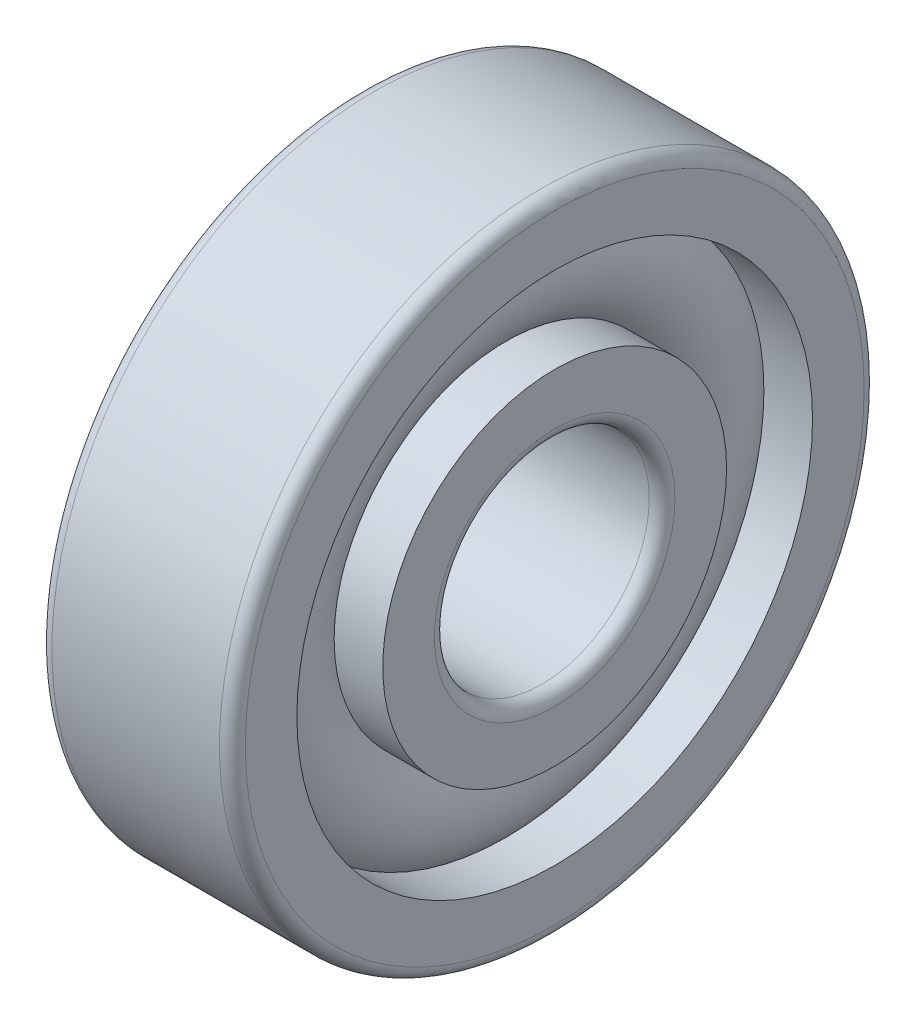
ISO-10303-21;
HEADER;
FILE_DESCRIPTION(('STEP AP214'),'2;1');
FILE_NAME('part.step','',(''),(''),'','','');
FILE_SCHEMA(('AUTOMOTIVE_DESIGN { 1 0 10303 214 1 1 1 1 }'));
ENDSEC;
DATA;
#1=APPLICATION_CONTEXT('core data for automotive mechanical design processes');
#2=APPLICATION_PROTOCOL_DEFINITION('international standard','automotive_design',2000,#1);
#3=PRODUCT_CONTEXT('',#1,'mechanical');
#4=PRODUCT('Part','Part','',(#3));
#5=PRODUCT_RELATED_PRODUCT_CATEGORY('part','',(#4));
#6=PRODUCT_DEFINITION_FORMATION('','',#4);
#7=PRODUCT_DEFINITION_CONTEXT('part definition',#1,'design');
#8=PRODUCT_DEFINITION('design','',#6,#7);
#9=PRODUCT_DEFINITION_SHAPE('','',#8);
#10=(LENGTH_UNIT() NAMED_UNIT(*) SI_UNIT(.MILLI.,.METRE.));
#11=(NAMED_UNIT(*) PLANE_ANGLE_UNIT() SI_UNIT($,.RADIAN.));
#12=(NAMED_UNIT(*) SI_UNIT($,.STERADIAN.) SOLID_ANGLE_UNIT());
#13=UNCERTAINTY_MEASURE_WITH_UNIT(LENGTH_MEASURE(1.E-05),#10,'distance_accuracy_value','');
#14=(GEOMETRIC_REPRESENTATION_CONTEXT(3) GLOBAL_UNCERTAINTY_ASSIGNED_CONTEXT((#13)) GLOBAL_UNIT_ASSIGNED_CONTEXT((#10,
#11,#12)) REPRESENTATION_CONTEXT('',''));
#15=CARTESIAN_POINT('',(0.,0.,0.));
#16=DIRECTION('',(0.,0.,1.));
#17=DIRECTION('',(1.,0.,0.));
#18=AXIS2_PLACEMENT_3D('',#15,#16,#17);
#19=CARTESIAN_POINT('',(0.,0.,0.));
#20=DIRECTION('',(-1.,0.,0.));
#21=DIRECTION('',(0.,0.,1.));
#22=AXIS2_PLACEMENT_3D('',#19,#20,#21);
#23=TOROIDAL_SURFACE('',#22,10.,3.);
#24=CARTESIAN_POINT('',(2.23606797749979,0.,0.));
#25=DIRECTION('',(-1.,0.,0.));
#26=DIRECTION('',(0.,0.,1.));
#27=AXIS2_PLACEMENT_3D('',#24,#25,#26);
#28=CIRCLE('',#27,12.);
#29=CARTESIAN_POINT('',(2.23606797749979,0.,12.));
#30=VERTEX_POINT('',#29);
#31=EDGE_CURVE('E35',#30,#30,#28,.F.);
#32=ORIENTED_EDGE('',*,*,#31,.T.);
#33=EDGE_LOOP('',(#32));
#34=FACE_BOUND('',#33,.T.);
#35=CARTESIAN_POINT('',(2.23606797749979,0.,0.));
#36=DIRECTION('',(-1.,0.,0.));
#37=DIRECTION('',(0.,0.,1.));
#38=AXIS2_PLACEMENT_3D('',#35,#36,#37);
#39=CIRCLE('',#38,8.);
#40=CARTESIAN_POINT('',(2.23606797749979,0.,8.));
#41=VERTEX_POINT('',#40);
#42=EDGE_CURVE('E10',#41,#41,#39,.T.);
#43=ORIENTED_EDGE('',*,*,#42,.T.);
#44=EDGE_LOOP('',(#43));
#45=FACE_BOUND('',#44,.T.);
#46=ADVANCED_FACE('F31',(#34,#45),#23,.T.);
#47=CARTESIAN_POINT('',(-20.6375,0.,0.));
#48=DIRECTION('',(1.,0.,0.));
#49=DIRECTION('',(0.,0.,-1.));
#50=AXIS2_PLACEMENT_3D('',#47,#48,#49);
#51=CYLINDRICAL_SURFACE('',#50,8.);
#52=CARTESIAN_POINT('',(4.5,0.,0.));
#53=DIRECTION('',(1.,0.,0.));
#54=DIRECTION('',(0.,0.,-1.));
#55=AXIS2_PLACEMENT_3D('',#52,#53,#54);
#56=CIRCLE('',#55,8.);
#57=CARTESIAN_POINT('',(4.5,0.,-8.));
#58=VERTEX_POINT('',#57);
#59=EDGE_CURVE('E44',#58,#58,#56,.T.);
#60=ORIENTED_EDGE('',*,*,#59,.F.);
#61=EDGE_LOOP('',(#60));
#62=FACE_BOUND('',#61,.T.);
#63=ORIENTED_EDGE('',*,*,#42,.F.);
#64=EDGE_LOOP('',(#63));
#65=FACE_BOUND('',#64,.T.);
#66=ADVANCED_FACE('F83',(#62,#65),#51,.T.);
#67=CARTESIAN_POINT('',(-20.6375,0.,0.));
#68=DIRECTION('',(1.,0.,0.));
#69=DIRECTION('',(0.,0.,-1.));
#70=AXIS2_PLACEMENT_3D('',#67,#68,#69);
#71=CYLINDRICAL_SURFACE('',#70,8.);
#72=CARTESIAN_POINT('',(-4.5,0.,0.));
#73=DIRECTION('',(1.,0.,0.));
#74=DIRECTION('',(0.,0.,-1.));
#75=AXIS2_PLACEMENT_3D('',#72,#73,#74);
#76=CIRCLE('',#75,8.);
#77=CARTESIAN_POINT('',(-4.5,0.,-8.));
#78=VERTEX_POINT('',#77);
#79=EDGE_CURVE('E53',#78,#78,#76,.T.);
#80=ORIENTED_EDGE('',*,*,#79,.T.);
#81=EDGE_LOOP('',(#80));
#82=FACE_BOUND('',#81,.T.);
#83=CARTESIAN_POINT('',(-2.23606797749979,0.,0.));
#84=DIRECTION('',(1.,0.,0.));
#85=DIRECTION('',(0.,0.,-1.));
#86=AXIS2_PLACEMENT_3D('',#83,#84,#85);
#87=CIRCLE('',#86,8.);
#88=CARTESIAN_POINT('',(-2.23606797749979,0.,-8.));
#89=VERTEX_POINT('',#88);
#90=EDGE_CURVE('E39',#89,#89,#87,.T.);
#91=ORIENTED_EDGE('',*,*,#90,.F.);
#92=EDGE_LOOP('',(#91));
#93=FACE_BOUND('',#92,.T.);
#94=ADVANCED_FACE('F86',(#82,#93),#71,.T.);
#95=CARTESIAN_POINT('',(4.5,5.6,0.));
#96=DIRECTION('',(1.,0.,0.));
#97=DIRECTION('',(0.,0.,-1.));
#98=AXIS2_PLACEMENT_3D('',#95,#96,#97);
#99=PLANE('',#98);
#100=ORIENTED_EDGE('',*,*,#59,.T.);
#101=EDGE_LOOP('',(#100));
#102=FACE_BOUND('',#101,.T.);
#103=CARTESIAN_POINT('',(4.5,0.,0.));
#104=DIRECTION('',(1.,0.,0.));
#105=DIRECTION('',(0.,0.,-1.));
#106=AXIS2_PLACEMENT_3D('',#103,#104,#105);
#107=CIRCLE('',#106,5.6);
#108=CARTESIAN_POINT('',(4.5,0.,-5.6));
#109=VERTEX_POINT('',#108);
#110=EDGE_CURVE('E75',#109,#109,#107,.T.);
#111=ORIENTED_EDGE('',*,*,#110,.F.);
#112=EDGE_LOOP('',(#111));
#113=FACE_BOUND('',#112,.T.);
#114=ADVANCED_FACE('F80',(#102,#113),#99,.T.);
#115=CARTESIAN_POINT('',(3.9,0.,0.));
#116=DIRECTION('',(1.,0.,0.));
#117=DIRECTION('',(0.,0.,-1.));
#118=AXIS2_PLACEMENT_3D('',#115,#116,#117);
#119=TOROIDAL_SURFACE('',#118,5.6,0.599999999999998);
#120=ORIENTED_EDGE('',*,*,#110,.T.);
#121=EDGE_LOOP('',(#120));
#122=FACE_BOUND('',#121,.T.);
#123=CARTESIAN_POINT('',(3.9,0.,0.));
#124=DIRECTION('',(1.,0.,0.));
#125=DIRECTION('',(0.,0.,-1.));
#126=AXIS2_PLACEMENT_3D('',#123,#124,#125);
#127=CIRCLE('',#126,5.);
#128=CARTESIAN_POINT('',(3.9,0.,-5.));
#129=VERTEX_POINT('',#128);
#130=EDGE_CURVE('E72',#129,#129,#127,.T.);
#131=ORIENTED_EDGE('',*,*,#130,.F.);
#132=EDGE_LOOP('',(#131));
#133=FACE_BOUND('',#132,.T.);
#134=ADVANCED_FACE('F97',(#122,#133),#119,.T.);
#135=CARTESIAN_POINT('',(-20.6375,0.,0.));
#136=DIRECTION('',(1.,0.,0.));
#137=DIRECTION('',(0.,0.,-1.));
#138=AXIS2_PLACEMENT_3D('',#135,#136,#137);
#139=CYLINDRICAL_SURFACE('',#138,5.);
#140=ORIENTED_EDGE('',*,*,#130,.T.);
#141=EDGE_LOOP('',(#140));
#142=FACE_BOUND('',#141,.T.);
#143=CARTESIAN_POINT('',(-3.9,0.,0.));
#144=DIRECTION('',(1.,0.,0.));
#145=DIRECTION('',(0.,0.,-1.));
#146=AXIS2_PLACEMENT_3D('',#143,#144,#145);
#147=CIRCLE('',#146,5.);
#148=CARTESIAN_POINT('',(-3.9,0.,-5.));
#149=VERTEX_POINT('',#148);
#150=EDGE_CURVE('E69',#149,#149,#147,.T.);
#151=ORIENTED_EDGE('',*,*,#150,.F.);
#152=EDGE_LOOP('',(#151));
#153=FACE_BOUND('',#152,.T.);
#154=ADVANCED_FACE('F100',(#142,#153),#139,.F.);
#155=CARTESIAN_POINT('',(-3.9,0.,0.));
#156=DIRECTION('',(1.,0.,0.));
#157=DIRECTION('',(0.,0.,-1.));
#158=AXIS2_PLACEMENT_3D('',#155,#156,#157);
#159=TOROIDAL_SURFACE('',#158,5.6,0.599999999999998);
#160=ORIENTED_EDGE('',*,*,#150,.T.);
#161=EDGE_LOOP('',(#160));
#162=FACE_BOUND('',#161,.T.);
#163=CARTESIAN_POINT('',(-4.5,0.,0.));
#164=DIRECTION('',(1.,0.,0.));
#165=DIRECTION('',(0.,0.,-1.));
#166=AXIS2_PLACEMENT_3D('',#163,#164,#165);
#167=CIRCLE('',#166,5.6);
#168=CARTESIAN_POINT('',(-4.5,0.,-5.6));
#169=VERTEX_POINT('',#168);
#170=EDGE_CURVE('E66',#169,#169,#167,.T.);
#171=ORIENTED_EDGE('',*,*,#170,.F.);
#172=EDGE_LOOP('',(#171));
#173=FACE_BOUND('',#172,.T.);
#174=ADVANCED_FACE('F104',(#162,#173),#159,.T.);
#175=CARTESIAN_POINT('',(-4.5,8.,0.));
#176=DIRECTION('',(-1.,0.,0.));
#177=DIRECTION('',(0.,0.,1.));
#178=AXIS2_PLACEMENT_3D('',#175,#176,#177);
#179=PLANE('',#178);
#180=ORIENTED_EDGE('',*,*,#170,.T.);
#181=EDGE_LOOP('',(#180));
#182=FACE_BOUND('',#181,.T.);
#183=ORIENTED_EDGE('',*,*,#79,.F.);
#184=EDGE_LOOP('',(#183));
#185=FACE_BOUND('',#184,.T.);
#186=ADVANCED_FACE('F108',(#182,#185),#179,.T.);
#187=CARTESIAN_POINT('',(-2.23606797749979,0.,0.));
#188=DIRECTION('',(1.,0.,0.));
#189=DIRECTION('',(0.,0.,-1.));
#190=AXIS2_PLACEMENT_3D('',#187,#188,#189);
#191=CIRCLE('',#190,12.);
#192=CARTESIAN_POINT('',(-2.23606797749979,0.,-12.));
#193=VERTEX_POINT('',#192);
#194=EDGE_CURVE('E47',#193,#193,#191,.F.);
#195=ORIENTED_EDGE('',*,*,#194,.T.);
#196=EDGE_LOOP('',(#195));
#197=FACE_BOUND('',#196,.T.);
#198=ORIENTED_EDGE('',*,*,#90,.T.);
#199=EDGE_LOOP('',(#198));
#200=FACE_BOUND('',#199,.T.);
#201=ADVANCED_FACE('F33',(#197,#200),#23,.T.);
#202=CARTESIAN_POINT('',(-20.6375,0.,0.));
#203=DIRECTION('',(1.,0.,0.));
#204=DIRECTION('',(0.,0.,-1.));
#205=AXIS2_PLACEMENT_3D('',#202,#203,#204);
#206=CYLINDRICAL_SURFACE('',#205,12.);
#207=CARTESIAN_POINT('',(4.5,0.,0.));
#208=DIRECTION('',(1.,0.,0.));
#209=DIRECTION('',(0.,0.,-1.));
#210=AXIS2_PLACEMENT_3D('',#207,#208,#209);
#211=CIRCLE('',#210,12.);
#212=CARTESIAN_POINT('',(4.5,0.,-12.));
#213=VERTEX_POINT('',#212);
#214=EDGE_CURVE('E49',#213,#213,#211,.T.);
#215=ORIENTED_EDGE('',*,*,#214,.T.);
#216=EDGE_LOOP('',(#215));
#217=FACE_BOUND('',#216,.T.);
#218=ORIENTED_EDGE('',*,*,#31,.F.);
#219=EDGE_LOOP('',(#218));
#220=FACE_BOUND('',#219,.T.);
#221=ADVANCED_FACE('F113',(#217,#220),#206,.F.);
#222=CARTESIAN_POINT('',(-20.6375,0.,0.));
#223=DIRECTION('',(1.,0.,0.));
#224=DIRECTION('',(0.,0.,-1.));
#225=AXIS2_PLACEMENT_3D('',#222,#223,#224);
#226=CYLINDRICAL_SURFACE('',#225,12.);
#227=CARTESIAN_POINT('',(-4.5,0.,0.));
#228=DIRECTION('',(1.,0.,0.));
#229=DIRECTION('',(0.,0.,-1.));
#230=AXIS2_PLACEMENT_3D('',#227,#228,#229);
#231=CIRCLE('',#230,12.);
#232=CARTESIAN_POINT('',(-4.5,0.,-12.));
#233=VERTEX_POINT('',#232);
#234=EDGE_CURVE('E144',#233,#233,#231,.T.);
#235=ORIENTED_EDGE('',*,*,#234,.F.);
#236=EDGE_LOOP('',(#235));
#237=FACE_BOUND('',#236,.T.);
#238=ORIENTED_EDGE('',*,*,#194,.F.);
#239=EDGE_LOOP('',(#238));
#240=FACE_BOUND('',#239,.T.);
#241=ADVANCED_FACE('F116',(#237,#240),#226,.F.);
#242=CARTESIAN_POINT('',(4.5,14.4,0.));
#243=DIRECTION('',(1.,0.,0.));
#244=DIRECTION('',(0.,0.,-1.));
#245=AXIS2_PLACEMENT_3D('',#242,#243,#244);
#246=PLANE('',#245);
#247=CARTESIAN_POINT('',(4.5,0.,0.));
#248=DIRECTION('',(1.,0.,0.));
#249=DIRECTION('',(0.,0.,-1.));
#250=AXIS2_PLACEMENT_3D('',#247,#248,#249);
#251=CIRCLE('',#250,14.4);
#252=CARTESIAN_POINT('',(4.5,0.,-14.4));
#253=VERTEX_POINT('',#252);
#254=EDGE_CURVE('E55',#253,#253,#251,.T.);
#255=ORIENTED_EDGE('',*,*,#254,.T.);
#256=EDGE_LOOP('',(#255));
#257=FACE_BOUND('',#256,.T.);
#258=ORIENTED_EDGE('',*,*,#214,.F.);
#259=EDGE_LOOP('',(#258));
#260=FACE_BOUND('',#259,.T.);
#261=ADVANCED_FACE('F117',(#257,#260),#246,.T.);
#262=CARTESIAN_POINT('',(3.9,0.,0.));
#263=DIRECTION('',(1.,0.,0.));
#264=DIRECTION('',(0.,0.,-1.));
#265=AXIS2_PLACEMENT_3D('',#262,#263,#264);
#266=TOROIDAL_SURFACE('',#265,14.4,0.6);
#267=CARTESIAN_POINT('',(3.9,0.,0.));
#268=DIRECTION('',(1.,0.,0.));
#269=DIRECTION('',(0.,0.,-1.));
#270=AXIS2_PLACEMENT_3D('',#267,#268,#269);
#271=CIRCLE('',#270,15.);
#272=CARTESIAN_POINT('',(3.9,0.,-15.));
#273=VERTEX_POINT('',#272);
#274=EDGE_CURVE('E60',#273,#273,#271,.T.);
#275=ORIENTED_EDGE('',*,*,#274,.T.);
#276=EDGE_LOOP('',(#275));
#277=FACE_BOUND('',#276,.T.);
#278=ORIENTED_EDGE('',*,*,#254,.F.);
#279=EDGE_LOOP('',(#278));
#280=FACE_BOUND('',#279,.T.);
#281=ADVANCED_FACE('F120',(#277,#280),#266,.T.);
#282=CARTESIAN_POINT('',(-20.6375,0.,0.));
#283=DIRECTION('',(1.,0.,0.));
#284=DIRECTION('',(0.,0.,-1.));
#285=AXIS2_PLACEMENT_3D('',#282,#283,#284);
#286=CYLINDRICAL_SURFACE('',#285,15.);
#287=CARTESIAN_POINT('',(-3.9,0.,0.));
#288=DIRECTION('',(1.,0.,0.));
#289=DIRECTION('',(0.,0.,-1.));
#290=AXIS2_PLACEMENT_3D('',#287,#288,#289);
#291=CIRCLE('',#290,15.);
#292=CARTESIAN_POINT('',(-3.9,0.,-15.));
#293=VERTEX_POINT('',#292);
#294=EDGE_CURVE('E148',#293,#293,#291,.T.);
#295=ORIENTED_EDGE('',*,*,#294,.T.);
#296=EDGE_LOOP('',(#295));
#297=FACE_BOUND('',#296,.T.);
#298=ORIENTED_EDGE('',*,*,#274,.F.);
#299=EDGE_LOOP('',(#298));
#300=FACE_BOUND('',#299,.T.);
#301=ADVANCED_FACE('F124',(#297,#300),#286,.T.);
#302=CARTESIAN_POINT('',(-3.9,0.,0.));
#303=DIRECTION('',(1.,0.,0.));
#304=DIRECTION('',(0.,0.,-1.));
#305=AXIS2_PLACEMENT_3D('',#302,#303,#304);
#306=TOROIDAL_SURFACE('',#305,14.4,0.6);
#307=CARTESIAN_POINT('',(-4.5,0.,0.));
#308=DIRECTION('',(1.,0.,0.));
#309=DIRECTION('',(0.,0.,-1.));
#310=AXIS2_PLACEMENT_3D('',#307,#308,#309);
#311=CIRCLE('',#310,14.4);
#312=CARTESIAN_POINT('',(-4.5,0.,-14.4));
#313=VERTEX_POINT('',#312);
#314=EDGE_CURVE('E145',#313,#313,#311,.T.);
#315=ORIENTED_EDGE('',*,*,#314,.T.);
#316=EDGE_LOOP('',(#315));
#317=FACE_BOUND('',#316,.T.);
#318=ORIENTED_EDGE('',*,*,#294,.F.);
#319=EDGE_LOOP('',(#318));
#320=FACE_BOUND('',#319,.T.);
#321=ADVANCED_FACE('F128',(#317,#320),#306,.T.);
#322=CARTESIAN_POINT('',(-4.5,12.,0.));
#323=DIRECTION('',(-1.,0.,0.));
#324=DIRECTION('',(0.,0.,1.));
#325=AXIS2_PLACEMENT_3D('',#322,#323,#324);
#326=PLANE('',#325);
#327=ORIENTED_EDGE('',*,*,#234,.T.);
#328=EDGE_LOOP('',(#327));
#329=FACE_BOUND('',#328,.T.);
#330=ORIENTED_EDGE('',*,*,#314,.F.);
#331=EDGE_LOOP('',(#330));
#332=FACE_BOUND('',#331,.T.);
#333=ADVANCED_FACE('F132',(#329,#332),#326,.T.);
#334=CLOSED_SHELL('',(#46,#66,#94,#114,#134,#154,#174,#186,#201,#221,#241,#261,#281,#301,#321,#333));
#335=MANIFOLD_SOLID_BREP('B2',#334);
#336=ADVANCED_BREP_SHAPE_REPRESENTATION('',(#18,#335),#14);
#337=SHAPE_DEFINITION_REPRESENTATION(#9,#336);
ENDSEC;
END-ISO-10303-21;
